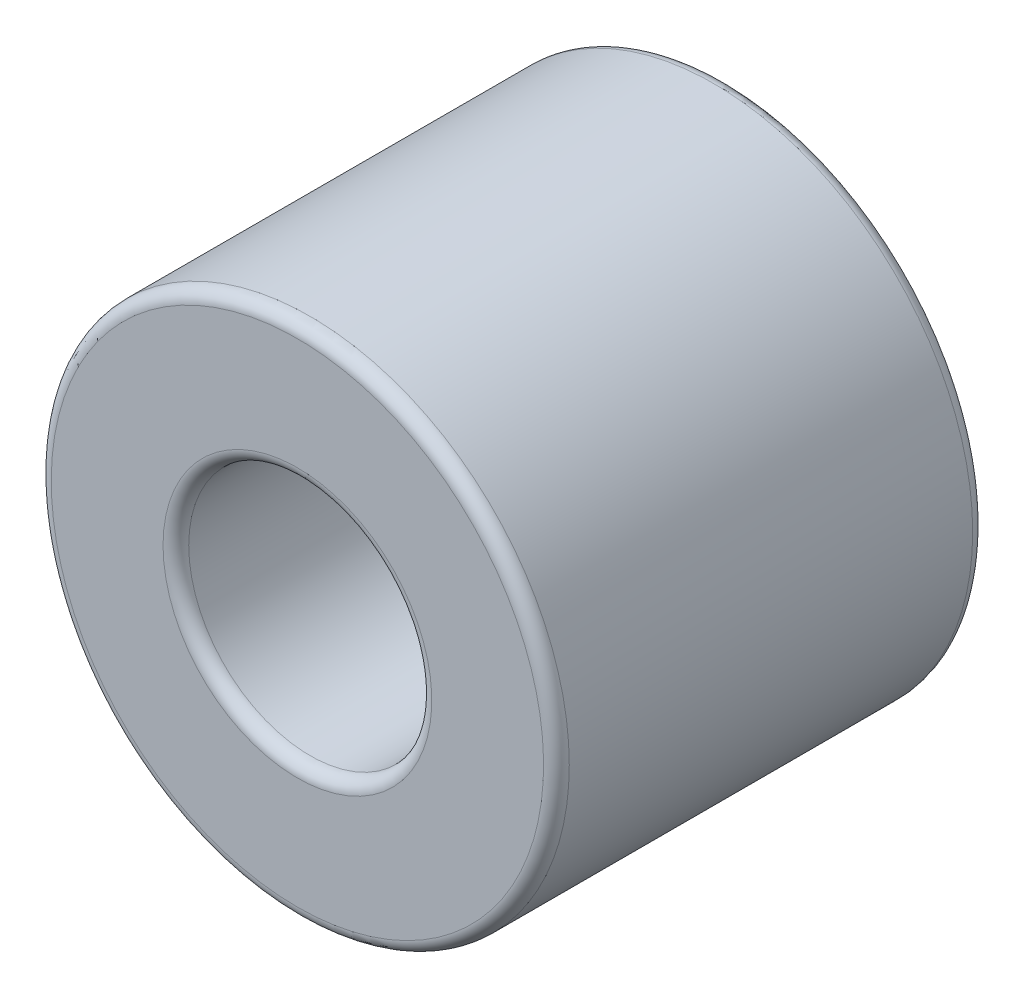
ISO-10303-21;
HEADER;
FILE_DESCRIPTION(('STEP AP214'),'2;1');
FILE_NAME('part.step','',(''),(''),'','','');
FILE_SCHEMA(('AUTOMOTIVE_DESIGN { 1 0 10303 214 1 1 1 1 }'));
ENDSEC;
DATA;
#1=APPLICATION_CONTEXT('core data for automotive mechanical design processes');
#2=APPLICATION_PROTOCOL_DEFINITION('international standard','automotive_design',2000,#1);
#3=PRODUCT_CONTEXT('',#1,'mechanical');
#4=PRODUCT('Part','Part','',(#3));
#5=PRODUCT_RELATED_PRODUCT_CATEGORY('part','',(#4));
#6=PRODUCT_DEFINITION_FORMATION('','',#4);
#7=PRODUCT_DEFINITION_CONTEXT('part definition',#1,'design');
#8=PRODUCT_DEFINITION('design','',#6,#7);
#9=PRODUCT_DEFINITION_SHAPE('','',#8);
#10=(LENGTH_UNIT() NAMED_UNIT(*) SI_UNIT(.MILLI.,.METRE.));
#11=(NAMED_UNIT(*) PLANE_ANGLE_UNIT() SI_UNIT($,.RADIAN.));
#12=(NAMED_UNIT(*) SI_UNIT($,.STERADIAN.) SOLID_ANGLE_UNIT());
#13=UNCERTAINTY_MEASURE_WITH_UNIT(LENGTH_MEASURE(1.E-05),#10,'distance_accuracy_value','');
#14=(GEOMETRIC_REPRESENTATION_CONTEXT(3) GLOBAL_UNCERTAINTY_ASSIGNED_CONTEXT((#13)) GLOBAL_UNIT_ASSIGNED_CONTEXT((#10,
#11,#12)) REPRESENTATION_CONTEXT('',''));
#15=CARTESIAN_POINT('',(0.,0.,0.));
#16=DIRECTION('',(0.,0.,1.));
#17=DIRECTION('',(1.,0.,0.));
#18=AXIS2_PLACEMENT_3D('',#15,#16,#17);
#19=CARTESIAN_POINT('',(8.89,-10.16,-0.785));
#20=DIRECTION('',(0.,0.,1.));
#21=DIRECTION('',(1.,0.,0.));
#22=AXIS2_PLACEMENT_3D('',#19,#20,#21);
#23=TOROIDAL_SURFACE('',#22,0.522999999999997,0.0499999999999983);
#24=CARTESIAN_POINT('',(8.89,-10.16,-0.785));
#25=DIRECTION('',(0.,0.,-1.));
#26=DIRECTION('',(-1.,0.,0.));
#27=AXIS2_PLACEMENT_3D('',#24,#25,#26);
#28=CIRCLE('',#27,0.472999999999998);
#29=CARTESIAN_POINT('',(8.417,-10.16,-0.785));
#30=VERTEX_POINT('',#29);
#31=EDGE_CURVE('E37',#30,#30,#28,.T.);
#32=ORIENTED_EDGE('',*,*,#31,.F.);
#33=EDGE_LOOP('',(#32));
#34=FACE_BOUND('',#33,.T.);
#35=CARTESIAN_POINT('',(8.89,-10.16,-0.834999999999998));
#36=DIRECTION('',(0.,0.,1.));
#37=DIRECTION('',(1.,0.,0.));
#38=AXIS2_PLACEMENT_3D('',#35,#36,#37);
#39=CIRCLE('',#38,0.522999999999997);
#40=CARTESIAN_POINT('',(9.413,-10.16,-0.834999999999999));
#41=VERTEX_POINT('',#40);
#42=EDGE_CURVE('E18',#41,#41,#39,.T.);
#43=ORIENTED_EDGE('',*,*,#42,.F.);
#44=EDGE_LOOP('',(#43));
#45=FACE_BOUND('',#44,.T.);
#46=ADVANCED_FACE('F14',(#34,#45),#23,.T.);
#47=CARTESIAN_POINT('',(8.89,-10.16,-0.785));
#48=DIRECTION('',(0.,0.,1.));
#49=DIRECTION('',(1.,0.,0.));
#50=AXIS2_PLACEMENT_3D('',#47,#48,#49);
#51=CYLINDRICAL_SURFACE('',#50,0.472999999999998);
#52=CARTESIAN_POINT('',(8.89,-10.16,0.785));
#53=DIRECTION('',(0.,0.,-1.));
#54=DIRECTION('',(-1.,0.,0.));
#55=AXIS2_PLACEMENT_3D('',#52,#53,#54);
#56=CIRCLE('',#55,0.472999999999997);
#57=CARTESIAN_POINT('',(8.417,-10.16,0.785));
#58=VERTEX_POINT('',#57);
#59=EDGE_CURVE('E33',#58,#58,#56,.T.);
#60=ORIENTED_EDGE('',*,*,#59,.F.);
#61=EDGE_LOOP('',(#60));
#62=FACE_BOUND('',#61,.T.);
#63=ORIENTED_EDGE('',*,*,#31,.T.);
#64=EDGE_LOOP('',(#63));
#65=FACE_BOUND('',#64,.T.);
#66=ADVANCED_FACE('F49',(#62,#65),#51,.F.);
#67=CARTESIAN_POINT('',(9.848,-11.13716,-0.835));
#68=DIRECTION('',(0.,0.,-1.));
#69=DIRECTION('',(-1.,0.,0.));
#70=AXIS2_PLACEMENT_3D('',#67,#68,#69);
#71=PLANE('',#70);
#72=ORIENTED_EDGE('',*,*,#42,.T.);
#73=EDGE_LOOP('',(#72));
#74=FACE_BOUND('',#73,.T.);
#75=CARTESIAN_POINT('',(8.89,-10.16,-0.835000000000001));
#76=DIRECTION('',(0.,0.,-1.));
#77=DIRECTION('',(-1.,0.,0.));
#78=AXIS2_PLACEMENT_3D('',#75,#76,#77);
#79=CIRCLE('',#78,0.958000000002174);
#80=CARTESIAN_POINT('',(7.93199999999783,-10.16,-0.835000000000001));
#81=VERTEX_POINT('',#80);
#82=EDGE_CURVE('E36',#81,#81,#79,.F.);
#83=ORIENTED_EDGE('',*,*,#82,.F.);
#84=EDGE_LOOP('',(#83));
#85=FACE_BOUND('',#84,.T.);
#86=ADVANCED_FACE('F46',(#74,#85),#71,.T.);
#87=CARTESIAN_POINT('',(8.89,-10.16,0.785));
#88=DIRECTION('',(0.,0.,-1.));
#89=DIRECTION('',(-1.,0.,0.));
#90=AXIS2_PLACEMENT_3D('',#87,#88,#89);
#91=TOROIDAL_SURFACE('',#90,0.522999999999992,0.0499999999999992);
#92=ORIENTED_EDGE('',*,*,#59,.T.);
#93=EDGE_LOOP('',(#92));
#94=FACE_BOUND('',#93,.T.);
#95=CARTESIAN_POINT('',(8.89,-10.16,0.834999999999999));
#96=DIRECTION('',(0.,0.,-1.));
#97=DIRECTION('',(-1.,0.,0.));
#98=AXIS2_PLACEMENT_3D('',#95,#96,#97);
#99=CIRCLE('',#98,0.522999999999992);
#100=CARTESIAN_POINT('',(8.36700000000001,-10.16,0.835));
#101=VERTEX_POINT('',#100);
#102=EDGE_CURVE('E32',#101,#101,#99,.T.);
#103=ORIENTED_EDGE('',*,*,#102,.F.);
#104=EDGE_LOOP('',(#103));
#105=FACE_BOUND('',#104,.T.);
#106=ADVANCED_FACE('F48',(#94,#105),#91,.T.);
#107=CARTESIAN_POINT('',(8.89,-10.16,-0.785));
#108=DIRECTION('',(0.,0.,-1.));
#109=DIRECTION('',(-1.,0.,0.));
#110=AXIS2_PLACEMENT_3D('',#107,#108,#109);
#111=TOROIDAL_SURFACE('',#110,0.957999999999999,0.0500000000000008);
#112=CARTESIAN_POINT('',(8.89,-10.16,-0.785));
#113=DIRECTION('',(0.,0.,1.));
#114=DIRECTION('',(1.,0.,0.));
#115=AXIS2_PLACEMENT_3D('',#112,#113,#114);
#116=CIRCLE('',#115,1.008);
#117=CARTESIAN_POINT('',(9.898,-10.16,-0.785));
#118=VERTEX_POINT('',#117);
#119=EDGE_CURVE('E27',#118,#118,#116,.T.);
#120=ORIENTED_EDGE('',*,*,#119,.F.);
#121=EDGE_LOOP('',(#120));
#122=FACE_BOUND('',#121,.T.);
#123=ORIENTED_EDGE('',*,*,#82,.T.);
#124=EDGE_LOOP('',(#123));
#125=FACE_BOUND('',#124,.T.);
#126=ADVANCED_FACE('F44',(#122,#125),#111,.T.);
#127=CARTESIAN_POINT('',(7.932,-11.13716,0.835));
#128=DIRECTION('',(0.,0.,1.));
#129=DIRECTION('',(1.,0.,0.));
#130=AXIS2_PLACEMENT_3D('',#127,#128,#129);
#131=PLANE('',#130);
#132=ORIENTED_EDGE('',*,*,#102,.T.);
#133=EDGE_LOOP('',(#132));
#134=FACE_BOUND('',#133,.T.);
#135=CARTESIAN_POINT('',(8.89,-10.16,0.835000000000005));
#136=DIRECTION('',(0.,0.,1.));
#137=DIRECTION('',(0.,-1.,0.));
#138=AXIS2_PLACEMENT_3D('',#135,#136,#137);
#139=CIRCLE('',#138,0.958000000001132);
#140=CARTESIAN_POINT('',(8.89,-11.1180000000011,0.835000000000005));
#141=VERTEX_POINT('',#140);
#142=EDGE_CURVE('E22',#141,#141,#139,.F.);
#143=ORIENTED_EDGE('',*,*,#142,.F.);
#144=EDGE_LOOP('',(#143));
#145=FACE_BOUND('',#144,.T.);
#146=ADVANCED_FACE('F67',(#134,#145),#131,.T.);
#147=CARTESIAN_POINT('',(8.89,-10.16,0.785));
#148=DIRECTION('',(0.,0.,-1.));
#149=DIRECTION('',(-1.,0.,0.));
#150=AXIS2_PLACEMENT_3D('',#147,#148,#149);
#151=CYLINDRICAL_SURFACE('',#150,1.008);
#152=ORIENTED_EDGE('',*,*,#119,.T.);
#153=EDGE_LOOP('',(#152));
#154=FACE_BOUND('',#153,.T.);
#155=CARTESIAN_POINT('',(8.89,-10.16,0.785));
#156=DIRECTION('',(0.,0.,1.));
#157=DIRECTION('',(1.,0.,0.));
#158=AXIS2_PLACEMENT_3D('',#155,#156,#157);
#159=CIRCLE('',#158,1.00800000000001);
#160=CARTESIAN_POINT('',(9.89800000000001,-10.16,0.785));
#161=VERTEX_POINT('',#160);
#162=EDGE_CURVE('E10',#161,#161,#159,.T.);
#163=ORIENTED_EDGE('',*,*,#162,.F.);
#164=EDGE_LOOP('',(#163));
#165=FACE_BOUND('',#164,.T.);
#166=ADVANCED_FACE('F63',(#154,#165),#151,.T.);
#167=CARTESIAN_POINT('',(8.89,-10.16,0.785));
#168=DIRECTION('',(0.,0.,1.));
#169=DIRECTION('',(0.,-1.,0.));
#170=AXIS2_PLACEMENT_3D('',#167,#168,#169);
#171=TOROIDAL_SURFACE('',#170,0.958000000000001,0.0500000000000053);
#172=ORIENTED_EDGE('',*,*,#162,.T.);
#173=EDGE_LOOP('',(#172));
#174=FACE_BOUND('',#173,.T.);
#175=ORIENTED_EDGE('',*,*,#142,.T.);
#176=EDGE_LOOP('',(#175));
#177=FACE_BOUND('',#176,.T.);
#178=ADVANCED_FACE('F16',(#174,#177),#171,.T.);
#179=CLOSED_SHELL('',(#46,#66,#86,#106,#126,#146,#166,#178));
#180=MANIFOLD_SOLID_BREP('B1',#179);
#181=ADVANCED_BREP_SHAPE_REPRESENTATION('',(#18,#180),#14);
#182=SHAPE_DEFINITION_REPRESENTATION(#9,#181);
ENDSEC;
END-ISO-10303-21;
